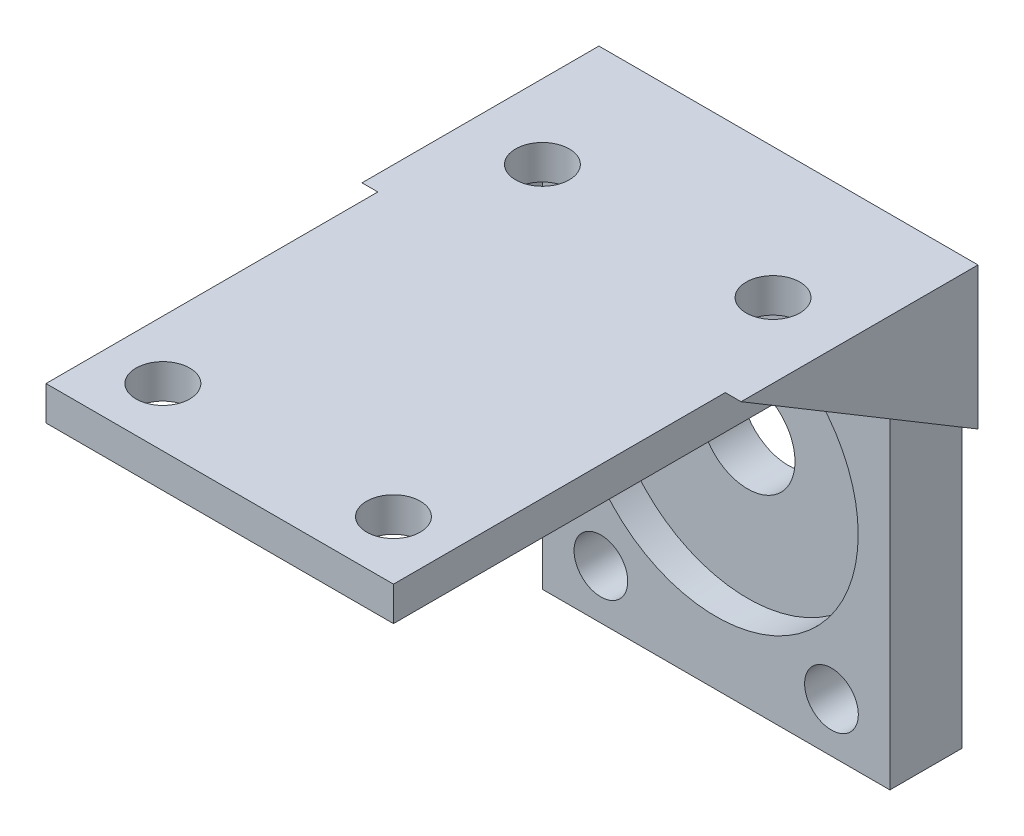
ISO-10303-21;
HEADER;
FILE_DESCRIPTION(('STEP AP214'),'2;1');
FILE_NAME('part.step','',(''),(''),'','','');
FILE_SCHEMA(('AUTOMOTIVE_DESIGN { 1 0 10303 214 1 1 1 1 }'));
ENDSEC;
DATA;
#1=APPLICATION_CONTEXT('core data for automotive mechanical design processes');
#2=APPLICATION_PROTOCOL_DEFINITION('international standard','automotive_design',2000,#1);
#3=PRODUCT_CONTEXT('',#1,'mechanical');
#4=PRODUCT('Part','Part','',(#3));
#5=PRODUCT_RELATED_PRODUCT_CATEGORY('part','',(#4));
#6=PRODUCT_DEFINITION_FORMATION('','',#4);
#7=PRODUCT_DEFINITION_CONTEXT('part definition',#1,'design');
#8=PRODUCT_DEFINITION('design','',#6,#7);
#9=PRODUCT_DEFINITION_SHAPE('','',#8);
#10=(LENGTH_UNIT() NAMED_UNIT(*) SI_UNIT(.MILLI.,.METRE.));
#11=(NAMED_UNIT(*) PLANE_ANGLE_UNIT() SI_UNIT($,.RADIAN.));
#12=(NAMED_UNIT(*) SI_UNIT($,.STERADIAN.) SOLID_ANGLE_UNIT());
#13=UNCERTAINTY_MEASURE_WITH_UNIT(LENGTH_MEASURE(1.E-05),#10,'distance_accuracy_value','');
#14=(GEOMETRIC_REPRESENTATION_CONTEXT(3) GLOBAL_UNCERTAINTY_ASSIGNED_CONTEXT((#13)) GLOBAL_UNIT_ASSIGNED_CONTEXT((#10,
#11,#12)) REPRESENTATION_CONTEXT('',''));
#15=CARTESIAN_POINT('',(0.,0.,0.));
#16=DIRECTION('',(0.,0.,1.));
#17=DIRECTION('',(1.,0.,0.));
#18=AXIS2_PLACEMENT_3D('',#15,#16,#17);
#19=CARTESIAN_POINT('',(0.,0.,4.577));
#20=DIRECTION('',(-1.,0.,0.));
#21=DIRECTION('',(0.,0.,1.));
#22=AXIS2_PLACEMENT_3D('',#19,#20,#21);
#23=PLANE('',#22);
#24=DIRECTION('',(0.,0.514495755427526,0.857492925712544));
#25=VECTOR('',#24,1.);
#26=CARTESIAN_POINT('',(0.,18.,0.));
#27=LINE('',#26,#25);
#28=CARTESIAN_POINT('',(0.,18.,0.));
#29=VERTEX_POINT('',#28);
#30=CARTESIAN_POINT('',(0.,20.7462,4.577));
#31=VERTEX_POINT('',#30);
#32=EDGE_CURVE('E49',#29,#31,#27,.T.);
#33=ORIENTED_EDGE('',*,*,#32,.F.);
#34=DIRECTION('',(0.,1.,0.));
#35=VECTOR('',#34,1.);
#36=CARTESIAN_POINT('',(0.,0.,0.));
#37=LINE('',#36,#35);
#38=CARTESIAN_POINT('',(0.,0.,0.));
#39=VERTEX_POINT('',#38);
#40=EDGE_CURVE('E155',#39,#29,#37,.T.);
#41=ORIENTED_EDGE('',*,*,#40,.F.);
#42=DIRECTION('',(0.,0.,-1.));
#43=VECTOR('',#42,1.);
#44=CARTESIAN_POINT('',(0.,0.,4.577));
#45=LINE('',#44,#43);
#46=CARTESIAN_POINT('',(0.,0.,4.577));
#47=VERTEX_POINT('',#46);
#48=EDGE_CURVE('E231',#47,#39,#45,.T.);
#49=ORIENTED_EDGE('',*,*,#48,.F.);
#50=DIRECTION('',(0.,1.,0.));
#51=VECTOR('',#50,1.);
#52=CARTESIAN_POINT('',(0.,0.,4.577));
#53=LINE('',#52,#51);
#54=EDGE_CURVE('E233',#47,#31,#53,.T.);
#55=ORIENTED_EDGE('',*,*,#54,.T.);
#56=EDGE_LOOP('',(#33,#41,#49,#55));
#57=FACE_BOUND('',#56,.T.);
#58=ADVANCED_FACE('F39',(#57),#23,.T.);
#59=CARTESIAN_POINT('',(22.,0.,4.577));
#60=DIRECTION('',(-1.,0.,0.));
#61=DIRECTION('',(0.,0.,1.));
#62=AXIS2_PLACEMENT_3D('',#59,#60,#61);
#63=PLANE('',#62);
#64=DIRECTION('',(0.,-0.514495755427526,-0.857492925712544));
#65=VECTOR('',#64,1.);
#66=CARTESIAN_POINT('',(22.,27.,15.));
#67=LINE('',#66,#65);
#68=CARTESIAN_POINT('',(22.,27.,15.));
#69=VERTEX_POINT('',#68);
#70=CARTESIAN_POINT('',(22.,24.833,11.3883333333333));
#71=VERTEX_POINT('',#70);
#72=EDGE_CURVE('E160',#69,#71,#67,.T.);
#73=ORIENTED_EDGE('',*,*,#72,.F.);
#74=DIRECTION('',(0.,0.,-1.));
#75=VECTOR('',#74,1.);
#76=CARTESIAN_POINT('',(22.,27.,4.577));
#77=LINE('',#76,#75);
#78=CARTESIAN_POINT('',(22.,27.,36.007));
#79=VERTEX_POINT('',#78);
#80=EDGE_CURVE('E242',#79,#69,#77,.T.);
#81=ORIENTED_EDGE('',*,*,#80,.F.);
#82=DIRECTION('',(0.,-1.,0.));
#83=VECTOR('',#82,1.);
#84=CARTESIAN_POINT('',(22.,27.,36.007));
#85=LINE('',#84,#83);
#86=CARTESIAN_POINT('',(22.,24.833,36.007));
#87=VERTEX_POINT('',#86);
#88=EDGE_CURVE('E206',#79,#87,#85,.T.);
#89=ORIENTED_EDGE('',*,*,#88,.T.);
#90=DIRECTION('',(0.,0.,-1.));
#91=VECTOR('',#90,1.);
#92=CARTESIAN_POINT('',(22.,24.833,36.007));
#93=LINE('',#92,#91);
#94=EDGE_CURVE('E217',#87,#71,#93,.T.);
#95=ORIENTED_EDGE('',*,*,#94,.T.);
#96=EDGE_LOOP('',(#73,#81,#89,#95));
#97=FACE_BOUND('',#96,.T.);
#98=ADVANCED_FACE('F301',(#97),#63,.F.);
#99=CARTESIAN_POINT('',(22.,20.7462,4.577));
#100=VERTEX_POINT('',#99);
#101=CARTESIAN_POINT('',(22.,18.,0.));
#102=VERTEX_POINT('',#101);
#103=EDGE_CURVE('E48',#100,#102,#67,.T.);
#104=ORIENTED_EDGE('',*,*,#103,.F.);
#105=DIRECTION('',(0.,1.,0.));
#106=VECTOR('',#105,1.);
#107=CARTESIAN_POINT('',(22.,0.,4.577));
#108=LINE('',#107,#106);
#109=CARTESIAN_POINT('',(22.,0.,4.577));
#110=VERTEX_POINT('',#109);
#111=EDGE_CURVE('E226',#110,#100,#108,.T.);
#112=ORIENTED_EDGE('',*,*,#111,.F.);
#113=DIRECTION('',(0.,0.,-1.));
#114=VECTOR('',#113,1.);
#115=CARTESIAN_POINT('',(22.,0.,4.577));
#116=LINE('',#115,#114);
#117=CARTESIAN_POINT('',(22.,0.,0.));
#118=VERTEX_POINT('',#117);
#119=EDGE_CURVE('E250',#110,#118,#116,.T.);
#120=ORIENTED_EDGE('',*,*,#119,.T.);
#121=DIRECTION('',(0.,1.,0.));
#122=VECTOR('',#121,1.);
#123=CARTESIAN_POINT('',(22.,0.,0.));
#124=LINE('',#123,#122);
#125=EDGE_CURVE('E236',#118,#102,#124,.T.);
#126=ORIENTED_EDGE('',*,*,#125,.T.);
#127=EDGE_LOOP('',(#104,#112,#120,#126));
#128=FACE_BOUND('',#127,.T.);
#129=ADVANCED_FACE('F330',(#128),#63,.F.);
#130=CARTESIAN_POINT('',(0.,0.,4.577));
#131=DIRECTION('',(0.,1.,0.));
#132=DIRECTION('',(0.,0.,1.));
#133=AXIS2_PLACEMENT_3D('',#130,#131,#132);
#134=PLANE('',#133);
#135=DIRECTION('',(1.,0.,0.));
#136=VECTOR('',#135,1.);
#137=CARTESIAN_POINT('',(0.,0.,0.));
#138=LINE('',#137,#136);
#139=EDGE_CURVE('E222',#39,#118,#138,.T.);
#140=ORIENTED_EDGE('',*,*,#139,.T.);
#141=ORIENTED_EDGE('',*,*,#119,.F.);
#142=DIRECTION('',(1.,0.,0.));
#143=VECTOR('',#142,1.);
#144=CARTESIAN_POINT('',(0.,0.,4.577));
#145=LINE('',#144,#143);
#146=EDGE_CURVE('E225',#47,#110,#145,.T.);
#147=ORIENTED_EDGE('',*,*,#146,.F.);
#148=ORIENTED_EDGE('',*,*,#48,.T.);
#149=EDGE_LOOP('',(#140,#141,#147,#148));
#150=FACE_BOUND('',#149,.T.);
#151=ADVANCED_FACE('F41',(#150),#134,.F.);
#152=CARTESIAN_POINT('',(0.,27.,4.577));
#153=DIRECTION('',(0.,1.,0.));
#154=DIRECTION('',(0.,0.,1.));
#155=AXIS2_PLACEMENT_3D('',#152,#153,#154);
#156=PLANE('',#155);
#157=CARTESIAN_POINT('',(18.3,27.,32.307));
#158=DIRECTION('',(0.,-1.,0.));
#159=DIRECTION('',(0.,0.,-1.));
#160=AXIS2_PLACEMENT_3D('',#157,#158,#159);
#161=CIRCLE('',#160,1.7);
#162=CARTESIAN_POINT('',(18.3,27.,30.607));
#163=VERTEX_POINT('',#162);
#164=EDGE_CURVE('E177',#163,#163,#161,.T.);
#165=ORIENTED_EDGE('',*,*,#164,.T.);
#166=EDGE_LOOP('',(#165));
#167=FACE_BOUND('',#166,.T.);
#168=CARTESIAN_POINT('',(3.7,27.,32.307));
#169=DIRECTION('',(0.,-1.,0.));
#170=DIRECTION('',(0.,0.,-1.));
#171=AXIS2_PLACEMENT_3D('',#168,#169,#170);
#172=CIRCLE('',#171,1.7);
#173=CARTESIAN_POINT('',(3.7,27.,30.607));
#174=VERTEX_POINT('',#173);
#175=EDGE_CURVE('E184',#174,#174,#172,.T.);
#176=ORIENTED_EDGE('',*,*,#175,.T.);
#177=EDGE_LOOP('',(#176));
#178=FACE_BOUND('',#177,.T.);
#179=CARTESIAN_POINT('',(18.3,27.,8.277));
#180=DIRECTION('',(0.,-1.,0.));
#181=DIRECTION('',(0.,0.,-1.));
#182=AXIS2_PLACEMENT_3D('',#179,#180,#181);
#183=CIRCLE('',#182,1.7);
#184=CARTESIAN_POINT('',(18.3,27.,6.577));
#185=VERTEX_POINT('',#184);
#186=EDGE_CURVE('E194',#185,#185,#183,.T.);
#187=ORIENTED_EDGE('',*,*,#186,.T.);
#188=EDGE_LOOP('',(#187));
#189=FACE_BOUND('',#188,.T.);
#190=CARTESIAN_POINT('',(3.7,27.,8.277));
#191=DIRECTION('',(0.,-1.,0.));
#192=DIRECTION('',(0.,0.,-1.));
#193=AXIS2_PLACEMENT_3D('',#190,#191,#192);
#194=CIRCLE('',#193,1.7);
#195=CARTESIAN_POINT('',(3.7,27.,6.577));
#196=VERTEX_POINT('',#195);
#197=EDGE_CURVE('E197',#196,#196,#194,.T.);
#198=ORIENTED_EDGE('',*,*,#197,.T.);
#199=EDGE_LOOP('',(#198));
#200=FACE_BOUND('',#199,.T.);
#201=DIRECTION('',(1.,0.,0.));
#202=VECTOR('',#201,1.);
#203=CARTESIAN_POINT('',(0.,27.,0.));
#204=LINE('',#203,#202);
#205=CARTESIAN_POINT('',(-1.,27.,0.));
#206=VERTEX_POINT('',#205);
#207=CARTESIAN_POINT('',(23.,27.,0.));
#208=VERTEX_POINT('',#207);
#209=EDGE_CURVE('E238',#206,#208,#204,.T.);
#210=ORIENTED_EDGE('',*,*,#209,.F.);
#211=DIRECTION('',(0.,0.,-1.));
#212=VECTOR('',#211,1.);
#213=CARTESIAN_POINT('',(-1.,27.,15.));
#214=LINE('',#213,#212);
#215=CARTESIAN_POINT('',(-1.,27.,15.));
#216=VERTEX_POINT('',#215);
#217=EDGE_CURVE('E144',#216,#206,#214,.T.);
#218=ORIENTED_EDGE('',*,*,#217,.F.);
#219=DIRECTION('',(1.,0.,0.));
#220=VECTOR('',#219,1.);
#221=CARTESIAN_POINT('',(-1.,27.,15.));
#222=LINE('',#221,#220);
#223=CARTESIAN_POINT('',(0.,27.,15.));
#224=VERTEX_POINT('',#223);
#225=EDGE_CURVE('E136',#216,#224,#222,.T.);
#226=ORIENTED_EDGE('',*,*,#225,.T.);
#227=DIRECTION('',(0.,0.,-1.));
#228=VECTOR('',#227,1.);
#229=CARTESIAN_POINT('',(0.,27.,4.577));
#230=LINE('',#229,#228);
#231=CARTESIAN_POINT('',(0.,27.,36.007));
#232=VERTEX_POINT('',#231);
#233=EDGE_CURVE('E245',#232,#224,#230,.T.);
#234=ORIENTED_EDGE('',*,*,#233,.F.);
#235=DIRECTION('',(1.,0.,0.));
#236=VECTOR('',#235,1.);
#237=CARTESIAN_POINT('',(0.,27.,36.007));
#238=LINE('',#237,#236);
#239=EDGE_CURVE('E214',#232,#79,#238,.T.);
#240=ORIENTED_EDGE('',*,*,#239,.T.);
#241=ORIENTED_EDGE('',*,*,#80,.T.);
#242=DIRECTION('',(-1.,0.,0.));
#243=VECTOR('',#242,1.);
#244=CARTESIAN_POINT('',(23.,27.,15.));
#245=LINE('',#244,#243);
#246=CARTESIAN_POINT('',(23.,27.,15.));
#247=VERTEX_POINT('',#246);
#248=EDGE_CURVE('E174',#247,#69,#245,.T.);
#249=ORIENTED_EDGE('',*,*,#248,.F.);
#250=DIRECTION('',(0.,0.,1.));
#251=VECTOR('',#250,1.);
#252=CARTESIAN_POINT('',(23.,27.,0.));
#253=LINE('',#252,#251);
#254=EDGE_CURVE('E161',#208,#247,#253,.T.);
#255=ORIENTED_EDGE('',*,*,#254,.F.);
#256=EDGE_LOOP('',(#210,#218,#226,#234,#240,#241,#249,#255));
#257=FACE_BOUND('',#256,.T.);
#258=ADVANCED_FACE('F304',(#167,#178,#189,#200,#257),#156,.T.);
#259=CARTESIAN_POINT('',(0.,24.833,11.3883333333333));
#260=VERTEX_POINT('',#259);
#261=EDGE_CURVE('E11',#260,#224,#27,.T.);
#262=ORIENTED_EDGE('',*,*,#261,.F.);
#263=DIRECTION('',(0.,0.,-1.));
#264=VECTOR('',#263,1.);
#265=CARTESIAN_POINT('',(0.,24.833,36.007));
#266=LINE('',#265,#264);
#267=CARTESIAN_POINT('',(0.,24.833,36.007));
#268=VERTEX_POINT('',#267);
#269=EDGE_CURVE('E223',#268,#260,#266,.T.);
#270=ORIENTED_EDGE('',*,*,#269,.F.);
#271=DIRECTION('',(0.,-1.,0.));
#272=VECTOR('',#271,1.);
#273=CARTESIAN_POINT('',(0.,27.,36.007));
#274=LINE('',#273,#272);
#275=EDGE_CURVE('E202',#232,#268,#274,.T.);
#276=ORIENTED_EDGE('',*,*,#275,.F.);
#277=ORIENTED_EDGE('',*,*,#233,.T.);
#278=EDGE_LOOP('',(#262,#270,#276,#277));
#279=FACE_BOUND('',#278,.T.);
#280=ADVANCED_FACE('F311',(#279),#23,.T.);
#281=CARTESIAN_POINT('',(0.,0.,4.577));
#282=DIRECTION('',(0.,0.,1.));
#283=DIRECTION('',(1.,0.,0.));
#284=AXIS2_PLACEMENT_3D('',#281,#282,#283);
#285=PLANE('',#284);
#286=CARTESIAN_POINT('',(10.9914296355716,13.,4.577));
#287=DIRECTION('',(0.,0.,1.));
#288=DIRECTION('',(1.,0.,0.));
#289=AXIS2_PLACEMENT_3D('',#286,#287,#288);
#290=CIRCLE('',#289,9.00000000000001);
#291=CARTESIAN_POINT('',(19.9914296355716,13.,4.577));
#292=VERTEX_POINT('',#291);
#293=EDGE_CURVE('E272',#292,#292,#290,.T.);
#294=ORIENTED_EDGE('',*,*,#293,.F.);
#295=EDGE_LOOP('',(#294));
#296=FACE_BOUND('',#295,.T.);
#297=CARTESIAN_POINT('',(3.7,3.133,4.577));
#298=DIRECTION('',(0.,0.,1.));
#299=DIRECTION('',(1.,0.,0.));
#300=AXIS2_PLACEMENT_3D('',#297,#298,#299);
#301=CIRCLE('',#300,1.7);
#302=CARTESIAN_POINT('',(5.4,3.133,4.577));
#303=VERTEX_POINT('',#302);
#304=EDGE_CURVE('E257',#303,#303,#301,.T.);
#305=ORIENTED_EDGE('',*,*,#304,.F.);
#306=EDGE_LOOP('',(#305));
#307=FACE_BOUND('',#306,.T.);
#308=CARTESIAN_POINT('',(18.3,3.133,4.577));
#309=DIRECTION('',(0.,0.,1.));
#310=DIRECTION('',(1.,0.,0.));
#311=AXIS2_PLACEMENT_3D('',#308,#309,#310);
#312=CIRCLE('',#311,1.7);
#313=CARTESIAN_POINT('',(20.,3.133,4.577));
#314=VERTEX_POINT('',#313);
#315=EDGE_CURVE('E256',#314,#314,#312,.T.);
#316=ORIENTED_EDGE('',*,*,#315,.F.);
#317=EDGE_LOOP('',(#316));
#318=FACE_BOUND('',#317,.T.);
#319=CARTESIAN_POINT('',(3.7,21.7,4.577));
#320=DIRECTION('',(0.,0.,1.));
#321=DIRECTION('',(1.,0.,0.));
#322=AXIS2_PLACEMENT_3D('',#319,#320,#321);
#323=CIRCLE('',#322,1.7);
#324=CARTESIAN_POINT('',(5.4,21.7,4.577));
#325=VERTEX_POINT('',#324);
#326=EDGE_CURVE('E251',#325,#325,#323,.T.);
#327=ORIENTED_EDGE('',*,*,#326,.F.);
#328=EDGE_LOOP('',(#327));
#329=FACE_BOUND('',#328,.T.);
#330=CARTESIAN_POINT('',(18.3,21.7,4.577));
#331=DIRECTION('',(0.,0.,1.));
#332=DIRECTION('',(1.,0.,0.));
#333=AXIS2_PLACEMENT_3D('',#330,#331,#332);
#334=CIRCLE('',#333,1.7);
#335=CARTESIAN_POINT('',(20.,21.7,4.577));
#336=VERTEX_POINT('',#335);
#337=EDGE_CURVE('E254',#336,#336,#334,.T.);
#338=ORIENTED_EDGE('',*,*,#337,.F.);
#339=EDGE_LOOP('',(#338));
#340=FACE_BOUND('',#339,.T.);
#341=DIRECTION('',(1.,0.,0.));
#342=VECTOR('',#341,1.);
#343=CARTESIAN_POINT('',(0.,24.833,4.577));
#344=LINE('',#343,#342);
#345=CARTESIAN_POINT('',(0.,24.833,4.577));
#346=VERTEX_POINT('',#345);
#347=CARTESIAN_POINT('',(22.,24.833,4.577));
#348=VERTEX_POINT('',#347);
#349=EDGE_CURVE('E200',#346,#348,#344,.T.);
#350=ORIENTED_EDGE('',*,*,#349,.F.);
#351=EDGE_CURVE('E63',#31,#346,#53,.T.);
#352=ORIENTED_EDGE('',*,*,#351,.F.);
#353=ORIENTED_EDGE('',*,*,#54,.F.);
#354=ORIENTED_EDGE('',*,*,#146,.T.);
#355=ORIENTED_EDGE('',*,*,#111,.T.);
#356=EDGE_CURVE('E227',#100,#348,#108,.T.);
#357=ORIENTED_EDGE('',*,*,#356,.T.);
#358=EDGE_LOOP('',(#350,#352,#353,#354,#355,#357));
#359=FACE_BOUND('',#358,.T.);
#360=ADVANCED_FACE('F286',(#296,#307,#318,#329,#340,#359),#285,.T.);
#361=CARTESIAN_POINT('',(0.,0.,0.));
#362=DIRECTION('',(0.,0.,1.));
#363=DIRECTION('',(1.,0.,0.));
#364=AXIS2_PLACEMENT_3D('',#361,#362,#363);
#365=PLANE('',#364);
#366=CARTESIAN_POINT('',(10.9914296355716,13.,0.));
#367=DIRECTION('',(0.,0.,1.));
#368=DIRECTION('',(1.,0.,0.));
#369=AXIS2_PLACEMENT_3D('',#366,#367,#368);
#370=CIRCLE('',#369,3.);
#371=CARTESIAN_POINT('',(13.9914296355716,13.,0.));
#372=VERTEX_POINT('',#371);
#373=EDGE_CURVE('E374',#372,#372,#370,.T.);
#374=ORIENTED_EDGE('',*,*,#373,.T.);
#375=EDGE_LOOP('',(#374));
#376=FACE_BOUND('',#375,.T.);
#377=CARTESIAN_POINT('',(3.7,3.133,0.));
#378=DIRECTION('',(0.,0.,1.));
#379=DIRECTION('',(1.,0.,0.));
#380=AXIS2_PLACEMENT_3D('',#377,#378,#379);
#381=CIRCLE('',#380,1.7);
#382=CARTESIAN_POINT('',(5.4,3.133,0.));
#383=VERTEX_POINT('',#382);
#384=EDGE_CURVE('E260',#383,#383,#381,.T.);
#385=ORIENTED_EDGE('',*,*,#384,.T.);
#386=EDGE_LOOP('',(#385));
#387=FACE_BOUND('',#386,.T.);
#388=CARTESIAN_POINT('',(18.3,3.133,0.));
#389=DIRECTION('',(0.,0.,1.));
#390=DIRECTION('',(1.,0.,0.));
#391=AXIS2_PLACEMENT_3D('',#388,#389,#390);
#392=CIRCLE('',#391,1.7);
#393=CARTESIAN_POINT('',(20.,3.133,0.));
#394=VERTEX_POINT('',#393);
#395=EDGE_CURVE('E253',#394,#394,#392,.T.);
#396=ORIENTED_EDGE('',*,*,#395,.T.);
#397=EDGE_LOOP('',(#396));
#398=FACE_BOUND('',#397,.T.);
#399=CARTESIAN_POINT('',(3.7,21.7,0.));
#400=DIRECTION('',(0.,0.,1.));
#401=DIRECTION('',(1.,0.,0.));
#402=AXIS2_PLACEMENT_3D('',#399,#400,#401);
#403=CIRCLE('',#402,1.7);
#404=CARTESIAN_POINT('',(5.4,21.7,0.));
#405=VERTEX_POINT('',#404);
#406=EDGE_CURVE('E249',#405,#405,#403,.T.);
#407=ORIENTED_EDGE('',*,*,#406,.T.);
#408=EDGE_LOOP('',(#407));
#409=FACE_BOUND('',#408,.T.);
#410=CARTESIAN_POINT('',(18.3,21.7,0.));
#411=DIRECTION('',(0.,0.,1.));
#412=DIRECTION('',(1.,0.,0.));
#413=AXIS2_PLACEMENT_3D('',#410,#411,#412);
#414=CIRCLE('',#413,1.7);
#415=CARTESIAN_POINT('',(20.,21.7,0.));
#416=VERTEX_POINT('',#415);
#417=EDGE_CURVE('E276',#416,#416,#414,.T.);
#418=ORIENTED_EDGE('',*,*,#417,.T.);
#419=EDGE_LOOP('',(#418));
#420=FACE_BOUND('',#419,.T.);
#421=ORIENTED_EDGE('',*,*,#139,.F.);
#422=ORIENTED_EDGE('',*,*,#40,.T.);
#423=DIRECTION('',(1.,0.,0.));
#424=VECTOR('',#423,1.);
#425=CARTESIAN_POINT('',(-1.,18.,0.));
#426=LINE('',#425,#424);
#427=CARTESIAN_POINT('',(-1.,18.,0.));
#428=VERTEX_POINT('',#427);
#429=EDGE_CURVE('E137',#428,#29,#426,.T.);
#430=ORIENTED_EDGE('',*,*,#429,.F.);
#431=DIRECTION('',(0.,-1.,0.));
#432=VECTOR('',#431,1.);
#433=CARTESIAN_POINT('',(-1.,27.,0.));
#434=LINE('',#433,#432);
#435=EDGE_CURVE('E143',#206,#428,#434,.T.);
#436=ORIENTED_EDGE('',*,*,#435,.F.);
#437=ORIENTED_EDGE('',*,*,#209,.T.);
#438=DIRECTION('',(0.,1.,0.));
#439=VECTOR('',#438,1.);
#440=CARTESIAN_POINT('',(23.,18.,0.));
#441=LINE('',#440,#439);
#442=CARTESIAN_POINT('',(23.,18.,0.));
#443=VERTEX_POINT('',#442);
#444=EDGE_CURVE('E166',#443,#208,#441,.T.);
#445=ORIENTED_EDGE('',*,*,#444,.F.);
#446=DIRECTION('',(-1.,0.,0.));
#447=VECTOR('',#446,1.);
#448=CARTESIAN_POINT('',(23.,18.,0.));
#449=LINE('',#448,#447);
#450=EDGE_CURVE('E167',#443,#102,#449,.T.);
#451=ORIENTED_EDGE('',*,*,#450,.T.);
#452=ORIENTED_EDGE('',*,*,#125,.F.);
#453=EDGE_LOOP('',(#421,#422,#430,#436,#437,#445,#451,#452));
#454=FACE_BOUND('',#453,.T.);
#455=ADVANCED_FACE('F154',(#376,#387,#398,#409,#420,#454),#365,.F.);
#456=CARTESIAN_POINT('',(0.,24.833,36.007));
#457=DIRECTION('',(0.,1.,0.));
#458=DIRECTION('',(0.,0.,1.));
#459=AXIS2_PLACEMENT_3D('',#456,#457,#458);
#460=PLANE('',#459);
#461=CARTESIAN_POINT('',(18.3,24.833,32.307));
#462=DIRECTION('',(0.,-1.,0.));
#463=DIRECTION('',(0.,0.,-1.));
#464=AXIS2_PLACEMENT_3D('',#461,#462,#463);
#465=CIRCLE('',#464,1.7);
#466=CARTESIAN_POINT('',(18.3,24.833,30.607));
#467=VERTEX_POINT('',#466);
#468=EDGE_CURVE('E178',#467,#467,#465,.T.);
#469=ORIENTED_EDGE('',*,*,#468,.F.);
#470=EDGE_LOOP('',(#469));
#471=FACE_BOUND('',#470,.T.);
#472=CARTESIAN_POINT('',(3.7,24.833,32.307));
#473=DIRECTION('',(0.,-1.,0.));
#474=DIRECTION('',(0.,0.,-1.));
#475=AXIS2_PLACEMENT_3D('',#472,#473,#474);
#476=CIRCLE('',#475,1.7);
#477=CARTESIAN_POINT('',(3.7,24.833,30.607));
#478=VERTEX_POINT('',#477);
#479=EDGE_CURVE('E185',#478,#478,#476,.T.);
#480=ORIENTED_EDGE('',*,*,#479,.F.);
#481=EDGE_LOOP('',(#480));
#482=FACE_BOUND('',#481,.T.);
#483=CARTESIAN_POINT('',(18.3,24.833,8.277));
#484=DIRECTION('',(0.,-1.,0.));
#485=DIRECTION('',(0.,0.,-1.));
#486=AXIS2_PLACEMENT_3D('',#483,#484,#485);
#487=CIRCLE('',#486,1.7);
#488=CARTESIAN_POINT('',(18.3,24.833,6.577));
#489=VERTEX_POINT('',#488);
#490=EDGE_CURVE('E189',#489,#489,#487,.T.);
#491=ORIENTED_EDGE('',*,*,#490,.F.);
#492=EDGE_LOOP('',(#491));
#493=FACE_BOUND('',#492,.T.);
#494=CARTESIAN_POINT('',(3.7,24.833,8.277));
#495=DIRECTION('',(0.,-1.,0.));
#496=DIRECTION('',(0.,0.,-1.));
#497=AXIS2_PLACEMENT_3D('',#494,#495,#496);
#498=CIRCLE('',#497,1.7);
#499=CARTESIAN_POINT('',(3.7,24.833,6.577));
#500=VERTEX_POINT('',#499);
#501=EDGE_CURVE('E193',#500,#500,#498,.T.);
#502=ORIENTED_EDGE('',*,*,#501,.F.);
#503=EDGE_LOOP('',(#502));
#504=FACE_BOUND('',#503,.T.);
#505=ORIENTED_EDGE('',*,*,#349,.T.);
#506=EDGE_CURVE('E213',#71,#348,#93,.T.);
#507=ORIENTED_EDGE('',*,*,#506,.F.);
#508=ORIENTED_EDGE('',*,*,#94,.F.);
#509=DIRECTION('',(1.,0.,0.));
#510=VECTOR('',#509,1.);
#511=CARTESIAN_POINT('',(0.,24.833,36.007));
#512=LINE('',#511,#510);
#513=EDGE_CURVE('E207',#268,#87,#512,.T.);
#514=ORIENTED_EDGE('',*,*,#513,.F.);
#515=ORIENTED_EDGE('',*,*,#269,.T.);
#516=EDGE_CURVE('E220',#260,#346,#266,.T.);
#517=ORIENTED_EDGE('',*,*,#516,.T.);
#518=EDGE_LOOP('',(#505,#507,#508,#514,#515,#517));
#519=FACE_BOUND('',#518,.T.);
#520=ADVANCED_FACE('F287',(#471,#482,#493,#504,#519),#460,.F.);
#521=CARTESIAN_POINT('',(0.,0.,36.007));
#522=DIRECTION('',(0.,0.,1.));
#523=DIRECTION('',(1.,0.,0.));
#524=AXIS2_PLACEMENT_3D('',#521,#522,#523);
#525=PLANE('',#524);
#526=ORIENTED_EDGE('',*,*,#275,.T.);
#527=ORIENTED_EDGE('',*,*,#513,.T.);
#528=ORIENTED_EDGE('',*,*,#88,.F.);
#529=ORIENTED_EDGE('',*,*,#239,.F.);
#530=EDGE_LOOP('',(#526,#527,#528,#529));
#531=FACE_BOUND('',#530,.T.);
#532=ADVANCED_FACE('F309',(#531),#525,.T.);
#533=CARTESIAN_POINT('',(3.7,27.,8.277));
#534=DIRECTION('',(0.,-1.,0.));
#535=DIRECTION('',(0.,0.,-1.));
#536=AXIS2_PLACEMENT_3D('',#533,#534,#535);
#537=CYLINDRICAL_SURFACE('',#536,1.7);
#538=CARTESIAN_POINT('',(3.7,27.,6.577));
#539=CARTESIAN_POINT('',(3.7,26.9774270833333,6.577));
#540=CARTESIAN_POINT('',(3.7,26.9548541666667,6.577));
#541=CARTESIAN_POINT('',(3.7,26.9097083333333,6.577));
#542=CARTESIAN_POINT('',(3.7,26.8871354166667,6.577));
#543=CARTESIAN_POINT('',(3.7,26.8419895833333,6.577));
#544=CARTESIAN_POINT('',(3.7,26.8194166666667,6.577));
#545=CARTESIAN_POINT('',(3.7,26.7742708333333,6.577));
#546=CARTESIAN_POINT('',(3.7,26.7516979166667,6.577));
#547=CARTESIAN_POINT('',(3.7,26.7065520833333,6.577));
#548=CARTESIAN_POINT('',(3.7,26.6839791666667,6.577));
#549=CARTESIAN_POINT('',(3.7,26.6388333333333,6.577));
#550=CARTESIAN_POINT('',(3.7,26.6162604166667,6.577));
#551=CARTESIAN_POINT('',(3.7,26.5711145833333,6.577));
#552=CARTESIAN_POINT('',(3.7,26.5485416666667,6.577));
#553=CARTESIAN_POINT('',(3.7,26.5033958333333,6.577));
#554=CARTESIAN_POINT('',(3.7,26.4808229166667,6.577));
#555=CARTESIAN_POINT('',(3.7,26.4356770833333,6.577));
#556=CARTESIAN_POINT('',(3.7,26.4131041666667,6.577));
#557=CARTESIAN_POINT('',(3.7,26.3679583333333,6.577));
#558=CARTESIAN_POINT('',(3.7,26.3453854166667,6.577));
#559=CARTESIAN_POINT('',(3.7,26.3002395833333,6.577));
#560=CARTESIAN_POINT('',(3.7,26.2776666666667,6.577));
#561=CARTESIAN_POINT('',(3.7,26.2325208333333,6.577));
#562=CARTESIAN_POINT('',(3.7,26.2099479166667,6.577));
#563=CARTESIAN_POINT('',(3.7,26.1648020833333,6.577));
#564=CARTESIAN_POINT('',(3.7,26.1422291666667,6.577));
#565=CARTESIAN_POINT('',(3.7,26.0970833333333,6.577));
#566=CARTESIAN_POINT('',(3.7,26.0745104166667,6.577));
#567=CARTESIAN_POINT('',(3.7,26.0293645833333,6.577));
#568=CARTESIAN_POINT('',(3.7,26.0067916666667,6.577));
#569=CARTESIAN_POINT('',(3.7,25.9616458333333,6.577));
#570=CARTESIAN_POINT('',(3.7,25.9390729166667,6.577));
#571=CARTESIAN_POINT('',(3.7,25.8939270833333,6.577));
#572=CARTESIAN_POINT('',(3.7,25.8713541666667,6.577));
#573=CARTESIAN_POINT('',(3.7,25.8262083333333,6.577));
#574=CARTESIAN_POINT('',(3.7,25.8036354166667,6.577));
#575=CARTESIAN_POINT('',(3.7,25.7584895833333,6.577));
#576=CARTESIAN_POINT('',(3.7,25.7359166666667,6.577));
#577=CARTESIAN_POINT('',(3.7,25.6907708333333,6.577));
#578=CARTESIAN_POINT('',(3.7,25.6681979166667,6.577));
#579=CARTESIAN_POINT('',(3.7,25.6230520833333,6.577));
#580=CARTESIAN_POINT('',(3.7,25.6004791666667,6.577));
#581=CARTESIAN_POINT('',(3.7,25.5553333333333,6.577));
#582=CARTESIAN_POINT('',(3.7,25.5327604166667,6.577));
#583=CARTESIAN_POINT('',(3.7,25.4876145833333,6.577));
#584=CARTESIAN_POINT('',(3.7,25.4650416666667,6.577));
#585=CARTESIAN_POINT('',(3.7,25.4198958333333,6.577));
#586=CARTESIAN_POINT('',(3.7,25.3973229166667,6.577));
#587=CARTESIAN_POINT('',(3.7,25.3521770833333,6.577));
#588=CARTESIAN_POINT('',(3.7,25.3296041666667,6.577));
#589=CARTESIAN_POINT('',(3.7,25.2844583333333,6.577));
#590=CARTESIAN_POINT('',(3.7,25.2618854166667,6.577));
#591=CARTESIAN_POINT('',(3.7,25.2167395833333,6.577));
#592=CARTESIAN_POINT('',(3.7,25.1941666666667,6.577));
#593=CARTESIAN_POINT('',(3.7,25.1490208333333,6.577));
#594=CARTESIAN_POINT('',(3.7,25.1264479166667,6.577));
#595=CARTESIAN_POINT('',(3.7,25.0813020833333,6.577));
#596=CARTESIAN_POINT('',(3.7,25.0587291666667,6.577));
#597=CARTESIAN_POINT('',(3.7,25.0135833333333,6.577));
#598=CARTESIAN_POINT('',(3.7,24.9910104166667,6.577));
#599=CARTESIAN_POINT('',(3.7,24.9458645833333,6.577));
#600=CARTESIAN_POINT('',(3.7,24.9232916666667,6.577));
#601=CARTESIAN_POINT('',(3.7,24.8781458333333,6.577));
#602=CARTESIAN_POINT('',(3.7,24.8555729166667,6.577));
#603=CARTESIAN_POINT('',(3.7,24.833,6.577));
#604=B_SPLINE_CURVE_WITH_KNOTS('',3,(#538,#539,#540,#541,#542,#543,#544,#545,#546,#547,#548,
#549,#550,#551,#552,#553,#554,#555,#556,#557,#558,#559,#560,#561,#562,#563,#564,#565,#566,#567,
#568,#569,#570,#571,#572,#573,#574,#575,#576,#577,#578,#579,#580,#581,#582,#583,#584,#585,#586,
#587,#588,#589,#590,#591,#592,#593,#594,#595,#596,#597,#598,#599,#600,#601,#602,#603),
.UNSPECIFIED.,.F.,.F.,(4,2,2,2,2,2,2,2,2,2,2,2,2,2,2,2,2,2,2,2,2,2,2,2,2,2,2,2,2,2,2,2,4),(0.,
0.0677187500000009,0.135437500000002,0.203156250000003,0.270875,0.338593750000001,
0.406312500000002,0.474031250000003,0.541750000000001,0.609468750000002,0.677187500000002,
0.74490625,0.812625000000001,0.880343750000002,0.948062500000003,1.01578125,1.0835,1.15121875,
1.2189375,1.28665625,1.354375,1.42209375,1.4898125,1.55753125,1.62525,1.69296875,1.7606875,
1.82840625,1.896125,1.96384375,2.0315625,2.09928125,2.167),.UNSPECIFIED.);
#605=EDGE_CURVE('BSEAM360',#196,#500,#604,.T.);
#606=ORIENTED_EDGE('',*,*,#197,.F.);
#607=ORIENTED_EDGE('',*,*,#501,.T.);
#608=ORIENTED_EDGE('',*,*,#605,.T.);
#609=ORIENTED_EDGE('',*,*,#605,.F.);
#610=EDGE_LOOP('',(#606,#608,#607,#609));
#611=FACE_BOUND('',#610,.T.);
#612=ADVANCED_FACE('F360',(#611),#537,.F.);
#613=CARTESIAN_POINT('',(18.3,27.,8.277));
#614=DIRECTION('',(0.,-1.,0.));
#615=DIRECTION('',(0.,0.,-1.));
#616=AXIS2_PLACEMENT_3D('',#613,#614,#615);
#617=CYLINDRICAL_SURFACE('',#616,1.7);
#618=CARTESIAN_POINT('',(18.3,27.,6.577));
#619=CARTESIAN_POINT('',(18.3,26.9774270833333,6.577));
#620=CARTESIAN_POINT('',(18.3,26.9548541666667,6.577));
#621=CARTESIAN_POINT('',(18.3,26.9097083333333,6.577));
#622=CARTESIAN_POINT('',(18.3,26.8871354166667,6.577));
#623=CARTESIAN_POINT('',(18.3,26.8419895833333,6.577));
#624=CARTESIAN_POINT('',(18.3,26.8194166666667,6.577));
#625=CARTESIAN_POINT('',(18.3,26.7742708333333,6.577));
#626=CARTESIAN_POINT('',(18.3,26.7516979166667,6.577));
#627=CARTESIAN_POINT('',(18.3,26.7065520833333,6.577));
#628=CARTESIAN_POINT('',(18.3,26.6839791666667,6.577));
#629=CARTESIAN_POINT('',(18.3,26.6388333333333,6.577));
#630=CARTESIAN_POINT('',(18.3,26.6162604166667,6.577));
#631=CARTESIAN_POINT('',(18.3,26.5711145833333,6.577));
#632=CARTESIAN_POINT('',(18.3,26.5485416666667,6.577));
#633=CARTESIAN_POINT('',(18.3,26.5033958333333,6.577));
#634=CARTESIAN_POINT('',(18.3,26.4808229166667,6.577));
#635=CARTESIAN_POINT('',(18.3,26.4356770833333,6.577));
#636=CARTESIAN_POINT('',(18.3,26.4131041666667,6.577));
#637=CARTESIAN_POINT('',(18.3,26.3679583333333,6.577));
#638=CARTESIAN_POINT('',(18.3,26.3453854166667,6.577));
#639=CARTESIAN_POINT('',(18.3,26.3002395833333,6.577));
#640=CARTESIAN_POINT('',(18.3,26.2776666666667,6.577));
#641=CARTESIAN_POINT('',(18.3,26.2325208333333,6.577));
#642=CARTESIAN_POINT('',(18.3,26.2099479166667,6.577));
#643=CARTESIAN_POINT('',(18.3,26.1648020833333,6.577));
#644=CARTESIAN_POINT('',(18.3,26.1422291666667,6.577));
#645=CARTESIAN_POINT('',(18.3,26.0970833333333,6.577));
#646=CARTESIAN_POINT('',(18.3,26.0745104166667,6.577));
#647=CARTESIAN_POINT('',(18.3,26.0293645833333,6.577));
#648=CARTESIAN_POINT('',(18.3,26.0067916666667,6.577));
#649=CARTESIAN_POINT('',(18.3,25.9616458333333,6.577));
#650=CARTESIAN_POINT('',(18.3,25.9390729166667,6.577));
#651=CARTESIAN_POINT('',(18.3,25.8939270833333,6.577));
#652=CARTESIAN_POINT('',(18.3,25.8713541666667,6.577));
#653=CARTESIAN_POINT('',(18.3,25.8262083333333,6.577));
#654=CARTESIAN_POINT('',(18.3,25.8036354166667,6.577));
#655=CARTESIAN_POINT('',(18.3,25.7584895833333,6.577));
#656=CARTESIAN_POINT('',(18.3,25.7359166666667,6.577));
#657=CARTESIAN_POINT('',(18.3,25.6907708333333,6.577));
#658=CARTESIAN_POINT('',(18.3,25.6681979166667,6.577));
#659=CARTESIAN_POINT('',(18.3,25.6230520833333,6.577));
#660=CARTESIAN_POINT('',(18.3,25.6004791666667,6.577));
#661=CARTESIAN_POINT('',(18.3,25.5553333333333,6.577));
#662=CARTESIAN_POINT('',(18.3,25.5327604166667,6.577));
#663=CARTESIAN_POINT('',(18.3,25.4876145833333,6.577));
#664=CARTESIAN_POINT('',(18.3,25.4650416666667,6.577));
#665=CARTESIAN_POINT('',(18.3,25.4198958333333,6.577));
#666=CARTESIAN_POINT('',(18.3,25.3973229166667,6.577));
#667=CARTESIAN_POINT('',(18.3,25.3521770833333,6.577));
#668=CARTESIAN_POINT('',(18.3,25.3296041666667,6.577));
#669=CARTESIAN_POINT('',(18.3,25.2844583333333,6.577));
#670=CARTESIAN_POINT('',(18.3,25.2618854166667,6.577));
#671=CARTESIAN_POINT('',(18.3,25.2167395833333,6.577));
#672=CARTESIAN_POINT('',(18.3,25.1941666666667,6.577));
#673=CARTESIAN_POINT('',(18.3,25.1490208333333,6.577));
#674=CARTESIAN_POINT('',(18.3,25.1264479166667,6.577));
#675=CARTESIAN_POINT('',(18.3,25.0813020833333,6.577));
#676=CARTESIAN_POINT('',(18.3,25.0587291666667,6.577));
#677=CARTESIAN_POINT('',(18.3,25.0135833333333,6.577));
#678=CARTESIAN_POINT('',(18.3,24.9910104166667,6.577));
#679=CARTESIAN_POINT('',(18.3,24.9458645833333,6.577));
#680=CARTESIAN_POINT('',(18.3,24.9232916666667,6.577));
#681=CARTESIAN_POINT('',(18.3,24.8781458333333,6.577));
#682=CARTESIAN_POINT('',(18.3,24.8555729166667,6.577));
#683=CARTESIAN_POINT('',(18.3,24.833,6.577));
#684=B_SPLINE_CURVE_WITH_KNOTS('',3,(#618,#619,#620,#621,#622,#623,#624,#625,#626,#627,#628,
#629,#630,#631,#632,#633,#634,#635,#636,#637,#638,#639,#640,#641,#642,#643,#644,#645,#646,#647,
#648,#649,#650,#651,#652,#653,#654,#655,#656,#657,#658,#659,#660,#661,#662,#663,#664,#665,#666,
#667,#668,#669,#670,#671,#672,#673,#674,#675,#676,#677,#678,#679,#680,#681,#682,#683),
.UNSPECIFIED.,.F.,.F.,(4,2,2,2,2,2,2,2,2,2,2,2,2,2,2,2,2,2,2,2,2,2,2,2,2,2,2,2,2,2,2,2,4),(0.,
0.0677187500000009,0.135437500000002,0.203156250000003,0.270875,0.338593750000001,
0.406312500000002,0.474031250000003,0.541750000000001,0.609468750000002,0.677187500000002,
0.74490625,0.812625000000001,0.880343750000002,0.948062500000003,1.01578125,1.0835,1.15121875,
1.2189375,1.28665625,1.354375,1.42209375,1.4898125,1.55753125,1.62525,1.69296875,1.7606875,
1.82840625,1.896125,1.96384375,2.0315625,2.09928125,2.167),.UNSPECIFIED.);
#685=EDGE_CURVE('BSEAM351',#185,#489,#684,.T.);
#686=ORIENTED_EDGE('',*,*,#186,.F.);
#687=ORIENTED_EDGE('',*,*,#490,.T.);
#688=ORIENTED_EDGE('',*,*,#685,.T.);
#689=ORIENTED_EDGE('',*,*,#685,.F.);
#690=EDGE_LOOP('',(#686,#688,#687,#689));
#691=FACE_BOUND('',#690,.T.);
#692=ADVANCED_FACE('F351',(#691),#617,.F.);
#693=CARTESIAN_POINT('',(3.7,27.,32.307));
#694=DIRECTION('',(0.,-1.,0.));
#695=DIRECTION('',(0.,0.,-1.));
#696=AXIS2_PLACEMENT_3D('',#693,#694,#695);
#697=CYLINDRICAL_SURFACE('',#696,1.7);
#698=CARTESIAN_POINT('',(3.7,27.,30.607));
#699=CARTESIAN_POINT('',(3.7,26.9774270833333,30.607));
#700=CARTESIAN_POINT('',(3.7,26.9548541666667,30.607));
#701=CARTESIAN_POINT('',(3.7,26.9097083333333,30.607));
#702=CARTESIAN_POINT('',(3.7,26.8871354166667,30.607));
#703=CARTESIAN_POINT('',(3.7,26.8419895833333,30.607));
#704=CARTESIAN_POINT('',(3.7,26.8194166666667,30.607));
#705=CARTESIAN_POINT('',(3.7,26.7742708333333,30.607));
#706=CARTESIAN_POINT('',(3.7,26.7516979166667,30.607));
#707=CARTESIAN_POINT('',(3.7,26.7065520833333,30.607));
#708=CARTESIAN_POINT('',(3.7,26.6839791666667,30.607));
#709=CARTESIAN_POINT('',(3.7,26.6388333333333,30.607));
#710=CARTESIAN_POINT('',(3.7,26.6162604166667,30.607));
#711=CARTESIAN_POINT('',(3.7,26.5711145833333,30.607));
#712=CARTESIAN_POINT('',(3.7,26.5485416666667,30.607));
#713=CARTESIAN_POINT('',(3.7,26.5033958333333,30.607));
#714=CARTESIAN_POINT('',(3.7,26.4808229166667,30.607));
#715=CARTESIAN_POINT('',(3.7,26.4356770833333,30.607));
#716=CARTESIAN_POINT('',(3.7,26.4131041666667,30.607));
#717=CARTESIAN_POINT('',(3.7,26.3679583333333,30.607));
#718=CARTESIAN_POINT('',(3.7,26.3453854166667,30.607));
#719=CARTESIAN_POINT('',(3.7,26.3002395833333,30.607));
#720=CARTESIAN_POINT('',(3.7,26.2776666666667,30.607));
#721=CARTESIAN_POINT('',(3.7,26.2325208333333,30.607));
#722=CARTESIAN_POINT('',(3.7,26.2099479166667,30.607));
#723=CARTESIAN_POINT('',(3.7,26.1648020833333,30.607));
#724=CARTESIAN_POINT('',(3.7,26.1422291666667,30.607));
#725=CARTESIAN_POINT('',(3.7,26.0970833333333,30.607));
#726=CARTESIAN_POINT('',(3.7,26.0745104166667,30.607));
#727=CARTESIAN_POINT('',(3.7,26.0293645833333,30.607));
#728=CARTESIAN_POINT('',(3.7,26.0067916666667,30.607));
#729=CARTESIAN_POINT('',(3.7,25.9616458333333,30.607));
#730=CARTESIAN_POINT('',(3.7,25.9390729166667,30.607));
#731=CARTESIAN_POINT('',(3.7,25.8939270833333,30.607));
#732=CARTESIAN_POINT('',(3.7,25.8713541666667,30.607));
#733=CARTESIAN_POINT('',(3.7,25.8262083333333,30.607));
#734=CARTESIAN_POINT('',(3.7,25.8036354166667,30.607));
#735=CARTESIAN_POINT('',(3.7,25.7584895833333,30.607));
#736=CARTESIAN_POINT('',(3.7,25.7359166666667,30.607));
#737=CARTESIAN_POINT('',(3.7,25.6907708333333,30.607));
#738=CARTESIAN_POINT('',(3.7,25.6681979166667,30.607));
#739=CARTESIAN_POINT('',(3.7,25.6230520833333,30.607));
#740=CARTESIAN_POINT('',(3.7,25.6004791666667,30.607));
#741=CARTESIAN_POINT('',(3.7,25.5553333333333,30.607));
#742=CARTESIAN_POINT('',(3.7,25.5327604166667,30.607));
#743=CARTESIAN_POINT('',(3.7,25.4876145833333,30.607));
#744=CARTESIAN_POINT('',(3.7,25.4650416666667,30.607));
#745=CARTESIAN_POINT('',(3.7,25.4198958333333,30.607));
#746=CARTESIAN_POINT('',(3.7,25.3973229166667,30.607));
#747=CARTESIAN_POINT('',(3.7,25.3521770833333,30.607));
#748=CARTESIAN_POINT('',(3.7,25.3296041666667,30.607));
#749=CARTESIAN_POINT('',(3.7,25.2844583333333,30.607));
#750=CARTESIAN_POINT('',(3.7,25.2618854166667,30.607));
#751=CARTESIAN_POINT('',(3.7,25.2167395833333,30.607));
#752=CARTESIAN_POINT('',(3.7,25.1941666666667,30.607));
#753=CARTESIAN_POINT('',(3.7,25.1490208333333,30.607));
#754=CARTESIAN_POINT('',(3.7,25.1264479166667,30.607));
#755=CARTESIAN_POINT('',(3.7,25.0813020833333,30.607));
#756=CARTESIAN_POINT('',(3.7,25.0587291666667,30.607));
#757=CARTESIAN_POINT('',(3.7,25.0135833333333,30.607));
#758=CARTESIAN_POINT('',(3.7,24.9910104166667,30.607));
#759=CARTESIAN_POINT('',(3.7,24.9458645833333,30.607));
#760=CARTESIAN_POINT('',(3.7,24.9232916666667,30.607));
#761=CARTESIAN_POINT('',(3.7,24.8781458333333,30.607));
#762=CARTESIAN_POINT('',(3.7,24.8555729166667,30.607));
#763=CARTESIAN_POINT('',(3.7,24.833,30.607));
#764=B_SPLINE_CURVE_WITH_KNOTS('',3,(#698,#699,#700,#701,#702,#703,#704,#705,#706,#707,#708,
#709,#710,#711,#712,#713,#714,#715,#716,#717,#718,#719,#720,#721,#722,#723,#724,#725,#726,#727,
#728,#729,#730,#731,#732,#733,#734,#735,#736,#737,#738,#739,#740,#741,#742,#743,#744,#745,#746,
#747,#748,#749,#750,#751,#752,#753,#754,#755,#756,#757,#758,#759,#760,#761,#762,#763),
.UNSPECIFIED.,.F.,.F.,(4,2,2,2,2,2,2,2,2,2,2,2,2,2,2,2,2,2,2,2,2,2,2,2,2,2,2,2,2,2,2,2,4),(0.,
0.0677187500000009,0.135437500000002,0.203156250000003,0.270875,0.338593750000001,
0.406312500000002,0.474031250000003,0.541750000000001,0.609468750000002,0.677187500000002,
0.74490625,0.812625000000001,0.880343750000002,0.948062500000003,1.01578125,1.0835,1.15121875,
1.2189375,1.28665625,1.354375,1.42209375,1.4898125,1.55753125,1.62525,1.69296875,1.7606875,
1.82840625,1.896125,1.96384375,2.0315625,2.09928125,2.167),.UNSPECIFIED.);
#765=EDGE_CURVE('BSEAM353',#174,#478,#764,.T.);
#766=ORIENTED_EDGE('',*,*,#175,.F.);
#767=ORIENTED_EDGE('',*,*,#479,.T.);
#768=ORIENTED_EDGE('',*,*,#765,.T.);
#769=ORIENTED_EDGE('',*,*,#765,.F.);
#770=EDGE_LOOP('',(#766,#768,#767,#769));
#771=FACE_BOUND('',#770,.T.);
#772=ADVANCED_FACE('F353',(#771),#697,.F.);
#773=CARTESIAN_POINT('',(18.3,27.,32.307));
#774=DIRECTION('',(0.,-1.,0.));
#775=DIRECTION('',(0.,0.,-1.));
#776=AXIS2_PLACEMENT_3D('',#773,#774,#775);
#777=CYLINDRICAL_SURFACE('',#776,1.7);
#778=CARTESIAN_POINT('',(18.3,27.,30.607));
#779=CARTESIAN_POINT('',(18.3,26.9774270833333,30.607));
#780=CARTESIAN_POINT('',(18.3,26.9548541666667,30.607));
#781=CARTESIAN_POINT('',(18.3,26.9097083333333,30.607));
#782=CARTESIAN_POINT('',(18.3,26.8871354166667,30.607));
#783=CARTESIAN_POINT('',(18.3,26.8419895833333,30.607));
#784=CARTESIAN_POINT('',(18.3,26.8194166666667,30.607));
#785=CARTESIAN_POINT('',(18.3,26.7742708333333,30.607));
#786=CARTESIAN_POINT('',(18.3,26.7516979166667,30.607));
#787=CARTESIAN_POINT('',(18.3,26.7065520833333,30.607));
#788=CARTESIAN_POINT('',(18.3,26.6839791666667,30.607));
#789=CARTESIAN_POINT('',(18.3,26.6388333333333,30.607));
#790=CARTESIAN_POINT('',(18.3,26.6162604166667,30.607));
#791=CARTESIAN_POINT('',(18.3,26.5711145833333,30.607));
#792=CARTESIAN_POINT('',(18.3,26.5485416666667,30.607));
#793=CARTESIAN_POINT('',(18.3,26.5033958333333,30.607));
#794=CARTESIAN_POINT('',(18.3,26.4808229166667,30.607));
#795=CARTESIAN_POINT('',(18.3,26.4356770833333,30.607));
#796=CARTESIAN_POINT('',(18.3,26.4131041666667,30.607));
#797=CARTESIAN_POINT('',(18.3,26.3679583333333,30.607));
#798=CARTESIAN_POINT('',(18.3,26.3453854166667,30.607));
#799=CARTESIAN_POINT('',(18.3,26.3002395833333,30.607));
#800=CARTESIAN_POINT('',(18.3,26.2776666666667,30.607));
#801=CARTESIAN_POINT('',(18.3,26.2325208333333,30.607));
#802=CARTESIAN_POINT('',(18.3,26.2099479166667,30.607));
#803=CARTESIAN_POINT('',(18.3,26.1648020833333,30.607));
#804=CARTESIAN_POINT('',(18.3,26.1422291666667,30.607));
#805=CARTESIAN_POINT('',(18.3,26.0970833333333,30.607));
#806=CARTESIAN_POINT('',(18.3,26.0745104166667,30.607));
#807=CARTESIAN_POINT('',(18.3,26.0293645833333,30.607));
#808=CARTESIAN_POINT('',(18.3,26.0067916666667,30.607));
#809=CARTESIAN_POINT('',(18.3,25.9616458333333,30.607));
#810=CARTESIAN_POINT('',(18.3,25.9390729166667,30.607));
#811=CARTESIAN_POINT('',(18.3,25.8939270833333,30.607));
#812=CARTESIAN_POINT('',(18.3,25.8713541666667,30.607));
#813=CARTESIAN_POINT('',(18.3,25.8262083333333,30.607));
#814=CARTESIAN_POINT('',(18.3,25.8036354166667,30.607));
#815=CARTESIAN_POINT('',(18.3,25.7584895833333,30.607));
#816=CARTESIAN_POINT('',(18.3,25.7359166666667,30.607));
#817=CARTESIAN_POINT('',(18.3,25.6907708333333,30.607));
#818=CARTESIAN_POINT('',(18.3,25.6681979166667,30.607));
#819=CARTESIAN_POINT('',(18.3,25.6230520833333,30.607));
#820=CARTESIAN_POINT('',(18.3,25.6004791666667,30.607));
#821=CARTESIAN_POINT('',(18.3,25.5553333333333,30.607));
#822=CARTESIAN_POINT('',(18.3,25.5327604166667,30.607));
#823=CARTESIAN_POINT('',(18.3,25.4876145833333,30.607));
#824=CARTESIAN_POINT('',(18.3,25.4650416666667,30.607));
#825=CARTESIAN_POINT('',(18.3,25.4198958333333,30.607));
#826=CARTESIAN_POINT('',(18.3,25.3973229166667,30.607));
#827=CARTESIAN_POINT('',(18.3,25.3521770833333,30.607));
#828=CARTESIAN_POINT('',(18.3,25.3296041666667,30.607));
#829=CARTESIAN_POINT('',(18.3,25.2844583333333,30.607));
#830=CARTESIAN_POINT('',(18.3,25.2618854166667,30.607));
#831=CARTESIAN_POINT('',(18.3,25.2167395833333,30.607));
#832=CARTESIAN_POINT('',(18.3,25.1941666666667,30.607));
#833=CARTESIAN_POINT('',(18.3,25.1490208333333,30.607));
#834=CARTESIAN_POINT('',(18.3,25.1264479166667,30.607));
#835=CARTESIAN_POINT('',(18.3,25.0813020833333,30.607));
#836=CARTESIAN_POINT('',(18.3,25.0587291666667,30.607));
#837=CARTESIAN_POINT('',(18.3,25.0135833333333,30.607));
#838=CARTESIAN_POINT('',(18.3,24.9910104166667,30.607));
#839=CARTESIAN_POINT('',(18.3,24.9458645833333,30.607));
#840=CARTESIAN_POINT('',(18.3,24.9232916666667,30.607));
#841=CARTESIAN_POINT('',(18.3,24.8781458333333,30.607));
#842=CARTESIAN_POINT('',(18.3,24.8555729166667,30.607));
#843=CARTESIAN_POINT('',(18.3,24.833,30.607));
#844=B_SPLINE_CURVE_WITH_KNOTS('',3,(#778,#779,#780,#781,#782,#783,#784,#785,#786,#787,#788,
#789,#790,#791,#792,#793,#794,#795,#796,#797,#798,#799,#800,#801,#802,#803,#804,#805,#806,#807,
#808,#809,#810,#811,#812,#813,#814,#815,#816,#817,#818,#819,#820,#821,#822,#823,#824,#825,#826,
#827,#828,#829,#830,#831,#832,#833,#834,#835,#836,#837,#838,#839,#840,#841,#842,#843),
.UNSPECIFIED.,.F.,.F.,(4,2,2,2,2,2,2,2,2,2,2,2,2,2,2,2,2,2,2,2,2,2,2,2,2,2,2,2,2,2,2,2,4),(0.,
0.0677187500000009,0.135437500000002,0.203156250000003,0.270875,0.338593750000001,
0.406312500000002,0.474031250000003,0.541750000000001,0.609468750000002,0.677187500000002,
0.74490625,0.812625000000001,0.880343750000002,0.948062500000003,1.01578125,1.0835,1.15121875,
1.2189375,1.28665625,1.354375,1.42209375,1.4898125,1.55753125,1.62525,1.69296875,1.7606875,
1.82840625,1.896125,1.96384375,2.0315625,2.09928125,2.167),.UNSPECIFIED.);
#845=EDGE_CURVE('BSEAM343',#163,#467,#844,.T.);
#846=ORIENTED_EDGE('',*,*,#164,.F.);
#847=ORIENTED_EDGE('',*,*,#468,.T.);
#848=ORIENTED_EDGE('',*,*,#845,.T.);
#849=ORIENTED_EDGE('',*,*,#845,.F.);
#850=EDGE_LOOP('',(#846,#848,#847,#849));
#851=FACE_BOUND('',#850,.T.);
#852=ADVANCED_FACE('F343',(#851),#777,.F.);
#853=CARTESIAN_POINT('',(23.,27.,15.));
#854=DIRECTION('',(0.,0.857492925712544,-0.514495755427526));
#855=DIRECTION('',(0.,0.514495755427526,0.857492925712544));
#856=AXIS2_PLACEMENT_3D('',#853,#854,#855);
#857=PLANE('',#856);
#858=ORIENTED_EDGE('',*,*,#72,.T.);
#859=EDGE_CURVE('E158',#71,#100,#67,.T.);
#860=ORIENTED_EDGE('',*,*,#859,.T.);
#861=ORIENTED_EDGE('',*,*,#103,.T.);
#862=ORIENTED_EDGE('',*,*,#450,.F.);
#863=DIRECTION('',(0.,-0.514495755427526,-0.857492925712544));
#864=VECTOR('',#863,1.);
#865=CARTESIAN_POINT('',(23.,27.,15.));
#866=LINE('',#865,#864);
#867=EDGE_CURVE('E168',#247,#443,#866,.T.);
#868=ORIENTED_EDGE('',*,*,#867,.F.);
#869=ORIENTED_EDGE('',*,*,#248,.T.);
#870=EDGE_LOOP('',(#858,#860,#861,#862,#868,#869));
#871=FACE_BOUND('',#870,.T.);
#872=ADVANCED_FACE('F300',(#871),#857,.F.);
#873=CARTESIAN_POINT('',(23.,0.,0.));
#874=DIRECTION('',(-1.,0.,0.));
#875=DIRECTION('',(0.,0.,1.));
#876=AXIS2_PLACEMENT_3D('',#873,#874,#875);
#877=PLANE('',#876);
#878=ORIENTED_EDGE('',*,*,#254,.T.);
#879=ORIENTED_EDGE('',*,*,#867,.T.);
#880=ORIENTED_EDGE('',*,*,#444,.T.);
#881=EDGE_LOOP('',(#878,#879,#880));
#882=FACE_BOUND('',#881,.T.);
#883=ADVANCED_FACE('F340',(#882),#877,.F.);
#884=CARTESIAN_POINT('',(22.,0.,0.));
#885=DIRECTION('',(-1.,0.,0.));
#886=DIRECTION('',(0.,0.,1.));
#887=AXIS2_PLACEMENT_3D('',#884,#885,#886);
#888=PLANE('',#887);
#889=ORIENTED_EDGE('',*,*,#859,.F.);
#890=ORIENTED_EDGE('',*,*,#506,.T.);
#891=ORIENTED_EDGE('',*,*,#356,.F.);
#892=EDGE_LOOP('',(#889,#890,#891));
#893=FACE_BOUND('',#892,.T.);
#894=ADVANCED_FACE('F295',(#893),#888,.T.);
#895=CARTESIAN_POINT('',(-1.,18.,0.));
#896=DIRECTION('',(0.,0.857492925712544,-0.514495755427526));
#897=DIRECTION('',(0.,0.514495755427526,0.857492925712544));
#898=AXIS2_PLACEMENT_3D('',#895,#896,#897);
#899=PLANE('',#898);
#900=ORIENTED_EDGE('',*,*,#32,.T.);
#901=EDGE_CURVE('E51',#31,#260,#27,.T.);
#902=ORIENTED_EDGE('',*,*,#901,.T.);
#903=ORIENTED_EDGE('',*,*,#261,.T.);
#904=ORIENTED_EDGE('',*,*,#225,.F.);
#905=DIRECTION('',(0.,0.514495755427526,0.857492925712544));
#906=VECTOR('',#905,1.);
#907=CARTESIAN_POINT('',(-1.,18.,0.));
#908=LINE('',#907,#906);
#909=EDGE_CURVE('E134',#428,#216,#908,.T.);
#910=ORIENTED_EDGE('',*,*,#909,.F.);
#911=ORIENTED_EDGE('',*,*,#429,.T.);
#912=EDGE_LOOP('',(#900,#902,#903,#904,#910,#911));
#913=FACE_BOUND('',#912,.T.);
#914=ADVANCED_FACE('F138',(#913),#899,.F.);
#915=CARTESIAN_POINT('',(-1.,0.,0.));
#916=DIRECTION('',(1.,0.,0.));
#917=DIRECTION('',(0.,0.,-1.));
#918=AXIS2_PLACEMENT_3D('',#915,#916,#917);
#919=PLANE('',#918);
#920=ORIENTED_EDGE('',*,*,#435,.T.);
#921=ORIENTED_EDGE('',*,*,#909,.T.);
#922=ORIENTED_EDGE('',*,*,#217,.T.);
#923=EDGE_LOOP('',(#920,#921,#922));
#924=FACE_BOUND('',#923,.T.);
#925=ADVANCED_FACE('F150',(#924),#919,.F.);
#926=CARTESIAN_POINT('',(0.,0.,0.));
#927=DIRECTION('',(1.,0.,0.));
#928=DIRECTION('',(0.,0.,-1.));
#929=AXIS2_PLACEMENT_3D('',#926,#927,#928);
#930=PLANE('',#929);
#931=ORIENTED_EDGE('',*,*,#901,.F.);
#932=ORIENTED_EDGE('',*,*,#351,.T.);
#933=ORIENTED_EDGE('',*,*,#516,.F.);
#934=EDGE_LOOP('',(#931,#932,#933));
#935=FACE_BOUND('',#934,.T.);
#936=ADVANCED_FACE('F288',(#935),#930,.T.);
#937=CARTESIAN_POINT('',(18.3,21.7,0.));
#938=DIRECTION('',(0.,0.,1.));
#939=DIRECTION('',(1.,0.,0.));
#940=AXIS2_PLACEMENT_3D('',#937,#938,#939);
#941=CYLINDRICAL_SURFACE('',#940,1.7);
#942=ORIENTED_EDGE('',*,*,#417,.F.);
#943=EDGE_LOOP('',(#942));
#944=FACE_BOUND('',#943,.T.);
#945=ORIENTED_EDGE('',*,*,#337,.T.);
#946=EDGE_LOOP('',(#945));
#947=FACE_BOUND('',#946,.T.);
#948=ADVANCED_FACE('F384',(#944,#947),#941,.F.);
#949=CARTESIAN_POINT('',(3.7,21.7,-5.423));
#950=DIRECTION('',(0.,0.,1.));
#951=DIRECTION('',(1.,0.,0.));
#952=AXIS2_PLACEMENT_3D('',#949,#950,#951);
#953=CYLINDRICAL_SURFACE('',#952,1.7);
#954=ORIENTED_EDGE('',*,*,#326,.T.);
#955=EDGE_LOOP('',(#954));
#956=FACE_BOUND('',#955,.T.);
#957=ORIENTED_EDGE('',*,*,#406,.F.);
#958=EDGE_LOOP('',(#957));
#959=FACE_BOUND('',#958,.T.);
#960=ADVANCED_FACE('F389',(#956,#959),#953,.F.);
#961=CARTESIAN_POINT('',(18.3,3.133,-5.423));
#962=DIRECTION('',(0.,0.,1.));
#963=DIRECTION('',(1.,0.,0.));
#964=AXIS2_PLACEMENT_3D('',#961,#962,#963);
#965=CYLINDRICAL_SURFACE('',#964,1.7);
#966=ORIENTED_EDGE('',*,*,#315,.T.);
#967=EDGE_LOOP('',(#966));
#968=FACE_BOUND('',#967,.T.);
#969=ORIENTED_EDGE('',*,*,#395,.F.);
#970=EDGE_LOOP('',(#969));
#971=FACE_BOUND('',#970,.T.);
#972=ADVANCED_FACE('F393',(#968,#971),#965,.F.);
#973=CARTESIAN_POINT('',(3.7,3.133,-5.423));
#974=DIRECTION('',(0.,0.,1.));
#975=DIRECTION('',(1.,0.,0.));
#976=AXIS2_PLACEMENT_3D('',#973,#974,#975);
#977=CYLINDRICAL_SURFACE('',#976,1.7);
#978=ORIENTED_EDGE('',*,*,#304,.T.);
#979=EDGE_LOOP('',(#978));
#980=FACE_BOUND('',#979,.T.);
#981=ORIENTED_EDGE('',*,*,#384,.F.);
#982=EDGE_LOOP('',(#981));
#983=FACE_BOUND('',#982,.T.);
#984=ADVANCED_FACE('F535',(#980,#983),#977,.F.);
#985=CARTESIAN_POINT('',(10.9914296355716,13.,2.577));
#986=DIRECTION('',(0.,0.,1.));
#987=DIRECTION('',(1.,0.,0.));
#988=AXIS2_PLACEMENT_3D('',#985,#986,#987);
#989=CYLINDRICAL_SURFACE('',#988,9.00000000000001);
#990=CARTESIAN_POINT('',(10.9914296355716,13.,2.577));
#991=DIRECTION('',(0.,0.,1.));
#992=DIRECTION('',(1.,0.,0.));
#993=AXIS2_PLACEMENT_3D('',#990,#991,#992);
#994=CIRCLE('',#993,9.00000000000001);
#995=CARTESIAN_POINT('',(19.9914296355716,13.,2.577));
#996=VERTEX_POINT('',#995);
#997=EDGE_CURVE('E268',#996,#996,#994,.T.);
#998=ORIENTED_EDGE('',*,*,#997,.F.);
#999=EDGE_LOOP('',(#998));
#1000=FACE_BOUND('',#999,.T.);
#1001=ORIENTED_EDGE('',*,*,#293,.T.);
#1002=EDGE_LOOP('',(#1001));
#1003=FACE_BOUND('',#1002,.T.);
#1004=ADVANCED_FACE('F537',(#1000,#1003),#989,.F.);
#1005=CARTESIAN_POINT('',(10.9914296355716,13.,2.577));
#1006=DIRECTION('',(0.,0.,1.));
#1007=DIRECTION('',(1.,0.,0.));
#1008=AXIS2_PLACEMENT_3D('',#1005,#1006,#1007);
#1009=PLANE('',#1008);
#1010=CARTESIAN_POINT('',(10.9914296355716,13.,2.577));
#1011=DIRECTION('',(0.,0.,1.));
#1012=DIRECTION('',(1.,0.,0.));
#1013=AXIS2_PLACEMENT_3D('',#1010,#1011,#1012);
#1014=CIRCLE('',#1013,3.);
#1015=CARTESIAN_POINT('',(13.9914296355716,13.,2.577));
#1016=VERTEX_POINT('',#1015);
#1017=EDGE_CURVE('E43',#1016,#1016,#1014,.T.);
#1018=ORIENTED_EDGE('',*,*,#1017,.F.);
#1019=EDGE_LOOP('',(#1018));
#1020=FACE_BOUND('',#1019,.T.);
#1021=ORIENTED_EDGE('',*,*,#997,.T.);
#1022=EDGE_LOOP('',(#1021));
#1023=FACE_BOUND('',#1022,.T.);
#1024=ADVANCED_FACE('F549',(#1020,#1023),#1009,.T.);
#1025=CARTESIAN_POINT('',(10.9914296355716,13.,0.));
#1026=DIRECTION('',(0.,0.,1.));
#1027=DIRECTION('',(1.,0.,0.));
#1028=AXIS2_PLACEMENT_3D('',#1025,#1026,#1027);
#1029=CYLINDRICAL_SURFACE('',#1028,3.);
#1030=ORIENTED_EDGE('',*,*,#1017,.T.);
#1031=EDGE_LOOP('',(#1030));
#1032=FACE_BOUND('',#1031,.T.);
#1033=ORIENTED_EDGE('',*,*,#373,.F.);
#1034=EDGE_LOOP('',(#1033));
#1035=FACE_BOUND('',#1034,.T.);
#1036=ADVANCED_FACE('F554',(#1032,#1035),#1029,.F.);
#1037=CLOSED_SHELL('',(#58,#98,#129,#151,#258,#280,#360,#455,#520,#532,#612,#692,#772,#852,#872,
#883,#894,#914,#925,#936,#948,#960,#972,#984,#1004,#1024,#1036));
#1038=MANIFOLD_SOLID_BREP('B2',#1037);
#1039=ADVANCED_BREP_SHAPE_REPRESENTATION('',(#18,#1038),#14);
#1040=SHAPE_DEFINITION_REPRESENTATION(#9,#1039);
ENDSEC;
END-ISO-10303-21;
